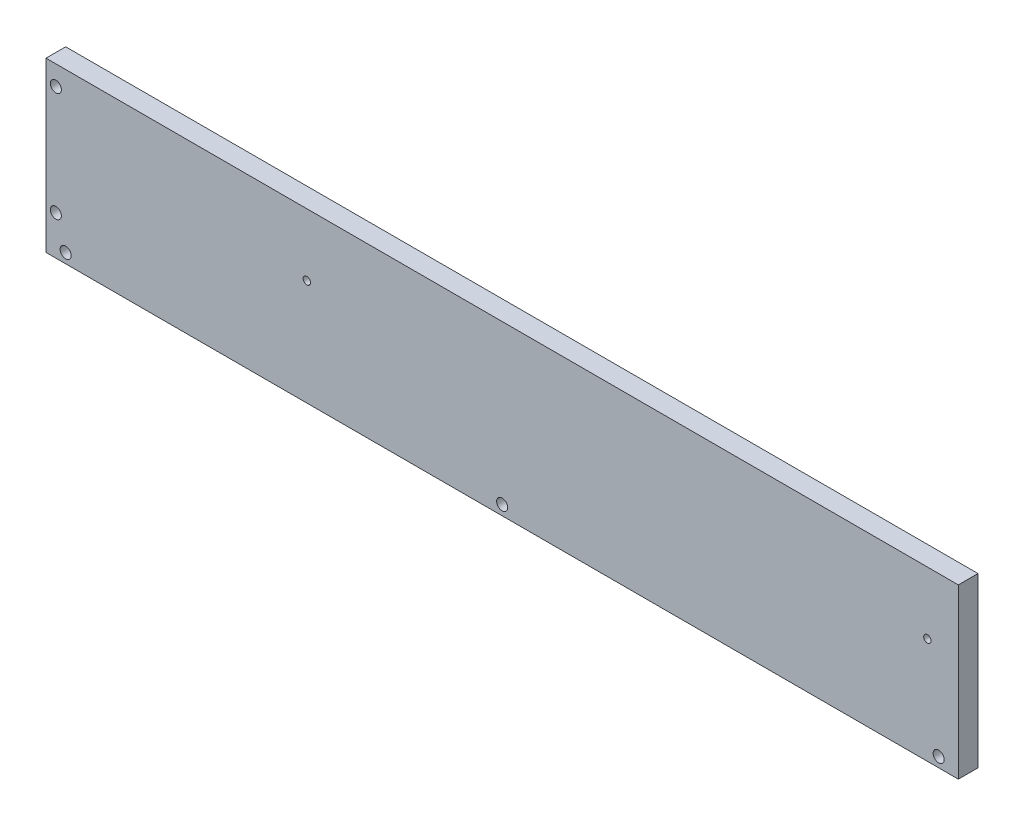
ISO-10303-21;
HEADER;
FILE_DESCRIPTION(('STEP AP214'),'2;1');
FILE_NAME('part.step','',(''),(''),'','','');
FILE_SCHEMA(('AUTOMOTIVE_DESIGN { 1 0 10303 214 1 1 1 1 }'));
ENDSEC;
DATA;
#1=APPLICATION_CONTEXT('core data for automotive mechanical design processes');
#2=APPLICATION_PROTOCOL_DEFINITION('international standard','automotive_design',2000,#1);
#3=PRODUCT_CONTEXT('',#1,'mechanical');
#4=PRODUCT('Part','Part','',(#3));
#5=PRODUCT_RELATED_PRODUCT_CATEGORY('part','',(#4));
#6=PRODUCT_DEFINITION_FORMATION('','',#4);
#7=PRODUCT_DEFINITION_CONTEXT('part definition',#1,'design');
#8=PRODUCT_DEFINITION('design','',#6,#7);
#9=PRODUCT_DEFINITION_SHAPE('','',#8);
#10=(LENGTH_UNIT() NAMED_UNIT(*) SI_UNIT(.MILLI.,.METRE.));
#11=(NAMED_UNIT(*) PLANE_ANGLE_UNIT() SI_UNIT($,.RADIAN.));
#12=(NAMED_UNIT(*) SI_UNIT($,.STERADIAN.) SOLID_ANGLE_UNIT());
#13=UNCERTAINTY_MEASURE_WITH_UNIT(LENGTH_MEASURE(1.E-05),#10,'distance_accuracy_value','');
#14=(GEOMETRIC_REPRESENTATION_CONTEXT(3) GLOBAL_UNCERTAINTY_ASSIGNED_CONTEXT((#13)) GLOBAL_UNIT_ASSIGNED_CONTEXT((#10,
#11,#12)) REPRESENTATION_CONTEXT('',''));
#15=CARTESIAN_POINT('',(0.,0.,0.));
#16=DIRECTION('',(0.,0.,1.));
#17=DIRECTION('',(1.,0.,0.));
#18=AXIS2_PLACEMENT_3D('',#15,#16,#17);
#19=CARTESIAN_POINT('',(0.,0.,6.35));
#20=DIRECTION('',(0.,0.,1.));
#21=DIRECTION('',(1.,0.,0.));
#22=AXIS2_PLACEMENT_3D('',#19,#20,#21);
#23=PLANE('',#22);
#24=CARTESIAN_POINT('',(84.24,34.25,6.35));
#25=DIRECTION('',(0.,0.,1.));
#26=DIRECTION('',(1.,0.,0.));
#27=AXIS2_PLACEMENT_3D('',#24,#25,#26);
#28=CIRCLE('',#27,1.190625);
#29=CARTESIAN_POINT('',(85.4306249999999,34.25,6.35));
#30=VERTEX_POINT('',#29);
#31=EDGE_CURVE('E143',#30,#30,#28,.T.);
#32=ORIENTED_EDGE('',*,*,#31,.F.);
#33=EDGE_LOOP('',(#32));
#34=FACE_BOUND('',#33,.T.);
#35=CARTESIAN_POINT('',(288.29,3.175,6.35));
#36=DIRECTION('',(0.,0.,1.));
#37=DIRECTION('',(1.,0.,0.));
#38=AXIS2_PLACEMENT_3D('',#35,#36,#37);
#39=CIRCLE('',#38,1.78593749999999);
#40=CARTESIAN_POINT('',(290.0759375,3.175,6.35));
#41=VERTEX_POINT('',#40);
#42=EDGE_CURVE('E131',#41,#41,#39,.T.);
#43=ORIENTED_EDGE('',*,*,#42,.F.);
#44=EDGE_LOOP('',(#43));
#45=FACE_BOUND('',#44,.T.);
#46=CARTESIAN_POINT('',(3.17499999999999,12.7,6.35));
#47=DIRECTION('',(0.,0.,1.));
#48=DIRECTION('',(1.,0.,0.));
#49=AXIS2_PLACEMENT_3D('',#46,#47,#48);
#50=CIRCLE('',#49,1.7859375);
#51=CARTESIAN_POINT('',(4.96093749999999,12.7,6.35));
#52=VERTEX_POINT('',#51);
#53=EDGE_CURVE('E119',#52,#52,#50,.T.);
#54=ORIENTED_EDGE('',*,*,#53,.F.);
#55=EDGE_LOOP('',(#54));
#56=FACE_BOUND('',#55,.T.);
#57=DIRECTION('',(-1.,0.,0.));
#58=VECTOR('',#57,1.);
#59=CARTESIAN_POINT('',(294.64,54.35,6.35));
#60=LINE('',#59,#58);
#61=CARTESIAN_POINT('',(294.64,54.35,6.35));
#62=VERTEX_POINT('',#61);
#63=CARTESIAN_POINT('',(0.,54.35,6.35));
#64=VERTEX_POINT('',#63);
#65=EDGE_CURVE('E89',#62,#64,#60,.T.);
#66=ORIENTED_EDGE('',*,*,#65,.T.);
#67=DIRECTION('',(0.,-1.,0.));
#68=VECTOR('',#67,1.);
#69=CARTESIAN_POINT('',(0.,54.35,6.35));
#70=LINE('',#69,#68);
#71=CARTESIAN_POINT('',(0.,0.,6.35));
#72=VERTEX_POINT('',#71);
#73=EDGE_CURVE('E84',#64,#72,#70,.T.);
#74=ORIENTED_EDGE('',*,*,#73,.T.);
#75=DIRECTION('',(1.,0.,0.));
#76=VECTOR('',#75,1.);
#77=CARTESIAN_POINT('',(0.,0.,6.35));
#78=LINE('',#77,#76);
#79=CARTESIAN_POINT('',(294.64,0.,6.35));
#80=VERTEX_POINT('',#79);
#81=EDGE_CURVE('E87',#72,#80,#78,.T.);
#82=ORIENTED_EDGE('',*,*,#81,.T.);
#83=DIRECTION('',(0.,1.,0.));
#84=VECTOR('',#83,1.);
#85=CARTESIAN_POINT('',(294.64,0.,6.35));
#86=LINE('',#85,#84);
#87=EDGE_CURVE('E54',#80,#62,#86,.T.);
#88=ORIENTED_EDGE('',*,*,#87,.T.);
#89=EDGE_LOOP('',(#66,#74,#82,#88));
#90=FACE_BOUND('',#89,.T.);
#91=CARTESIAN_POINT('',(3.17499999999998,48.,6.35));
#92=DIRECTION('',(0.,0.,1.));
#93=DIRECTION('',(1.,0.,0.));
#94=AXIS2_PLACEMENT_3D('',#91,#92,#93);
#95=CIRCLE('',#94,1.7859375);
#96=CARTESIAN_POINT('',(4.96093749999998,48.,6.35));
#97=VERTEX_POINT('',#96);
#98=EDGE_CURVE('E104',#97,#97,#95,.T.);
#99=ORIENTED_EDGE('',*,*,#98,.F.);
#100=EDGE_LOOP('',(#99));
#101=FACE_BOUND('',#100,.T.);
#102=CARTESIAN_POINT('',(6.35,3.175,6.35));
#103=DIRECTION('',(0.,0.,1.));
#104=DIRECTION('',(1.,0.,0.));
#105=AXIS2_PLACEMENT_3D('',#102,#103,#104);
#106=CIRCLE('',#105,1.7859375);
#107=CARTESIAN_POINT('',(8.1359375,3.175,6.35));
#108=VERTEX_POINT('',#107);
#109=EDGE_CURVE('E125',#108,#108,#106,.T.);
#110=ORIENTED_EDGE('',*,*,#109,.F.);
#111=EDGE_LOOP('',(#110));
#112=FACE_BOUND('',#111,.T.);
#113=CARTESIAN_POINT('',(147.32,3.175,6.35));
#114=DIRECTION('',(0.,0.,1.));
#115=DIRECTION('',(1.,0.,0.));
#116=AXIS2_PLACEMENT_3D('',#113,#114,#115);
#117=CIRCLE('',#116,1.78593749999999);
#118=CARTESIAN_POINT('',(149.1059375,3.175,6.35));
#119=VERTEX_POINT('',#118);
#120=EDGE_CURVE('E137',#119,#119,#117,.T.);
#121=ORIENTED_EDGE('',*,*,#120,.F.);
#122=EDGE_LOOP('',(#121));
#123=FACE_BOUND('',#122,.T.);
#124=CARTESIAN_POINT('',(284.64,34.25,6.35));
#125=DIRECTION('',(0.,0.,1.));
#126=DIRECTION('',(1.,0.,0.));
#127=AXIS2_PLACEMENT_3D('',#124,#125,#126);
#128=CIRCLE('',#127,1.19062499999998);
#129=CARTESIAN_POINT('',(285.830625,34.25,6.35));
#130=VERTEX_POINT('',#129);
#131=EDGE_CURVE('E149',#130,#130,#128,.T.);
#132=ORIENTED_EDGE('',*,*,#131,.F.);
#133=EDGE_LOOP('',(#132));
#134=FACE_BOUND('',#133,.T.);
#135=ADVANCED_FACE('F37',(#34,#45,#56,#90,#101,#112,#123,#134),#23,.T.);
#136=CARTESIAN_POINT('',(0.,0.,0.));
#137=DIRECTION('',(0.,0.,1.));
#138=DIRECTION('',(1.,0.,0.));
#139=AXIS2_PLACEMENT_3D('',#136,#137,#138);
#140=PLANE('',#139);
#141=DIRECTION('',(-1.,0.,0.));
#142=VECTOR('',#141,1.);
#143=CARTESIAN_POINT('',(294.64,54.35,0.));
#144=LINE('',#143,#142);
#145=CARTESIAN_POINT('',(294.64,54.35,0.));
#146=VERTEX_POINT('',#145);
#147=CARTESIAN_POINT('',(0.,54.35,0.));
#148=VERTEX_POINT('',#147);
#149=EDGE_CURVE('E101',#146,#148,#144,.T.);
#150=ORIENTED_EDGE('',*,*,#149,.F.);
#151=DIRECTION('',(0.,1.,0.));
#152=VECTOR('',#151,1.);
#153=CARTESIAN_POINT('',(294.64,0.,0.));
#154=LINE('',#153,#152);
#155=CARTESIAN_POINT('',(294.64,0.,0.));
#156=VERTEX_POINT('',#155);
#157=EDGE_CURVE('E77',#156,#146,#154,.T.);
#158=ORIENTED_EDGE('',*,*,#157,.F.);
#159=DIRECTION('',(1.,0.,0.));
#160=VECTOR('',#159,1.);
#161=CARTESIAN_POINT('',(0.,0.,0.));
#162=LINE('',#161,#160);
#163=CARTESIAN_POINT('',(0.,0.,0.));
#164=VERTEX_POINT('',#163);
#165=EDGE_CURVE('E71',#164,#156,#162,.T.);
#166=ORIENTED_EDGE('',*,*,#165,.F.);
#167=DIRECTION('',(0.,-1.,0.));
#168=VECTOR('',#167,1.);
#169=CARTESIAN_POINT('',(0.,54.35,0.));
#170=LINE('',#169,#168);
#171=EDGE_CURVE('E93',#148,#164,#170,.T.);
#172=ORIENTED_EDGE('',*,*,#171,.F.);
#173=EDGE_LOOP('',(#150,#158,#166,#172));
#174=FACE_BOUND('',#173,.T.);
#175=CARTESIAN_POINT('',(3.17499999999998,48.,0.));
#176=DIRECTION('',(0.,0.,1.));
#177=DIRECTION('',(1.,0.,0.));
#178=AXIS2_PLACEMENT_3D('',#175,#176,#177);
#179=CIRCLE('',#178,1.7859375);
#180=CARTESIAN_POINT('',(4.96093749999998,48.,0.));
#181=VERTEX_POINT('',#180);
#182=EDGE_CURVE('E116',#181,#181,#179,.T.);
#183=ORIENTED_EDGE('',*,*,#182,.T.);
#184=EDGE_LOOP('',(#183));
#185=FACE_BOUND('',#184,.T.);
#186=CARTESIAN_POINT('',(3.17499999999999,12.7,0.));
#187=DIRECTION('',(0.,0.,1.));
#188=DIRECTION('',(1.,0.,0.));
#189=AXIS2_PLACEMENT_3D('',#186,#187,#188);
#190=CIRCLE('',#189,1.7859375);
#191=CARTESIAN_POINT('',(4.96093749999999,12.7,0.));
#192=VERTEX_POINT('',#191);
#193=EDGE_CURVE('E122',#192,#192,#190,.T.);
#194=ORIENTED_EDGE('',*,*,#193,.T.);
#195=EDGE_LOOP('',(#194));
#196=FACE_BOUND('',#195,.T.);
#197=CARTESIAN_POINT('',(6.35,3.175,0.));
#198=DIRECTION('',(0.,0.,1.));
#199=DIRECTION('',(1.,0.,0.));
#200=AXIS2_PLACEMENT_3D('',#197,#198,#199);
#201=CIRCLE('',#200,1.7859375);
#202=CARTESIAN_POINT('',(8.1359375,3.175,0.));
#203=VERTEX_POINT('',#202);
#204=EDGE_CURVE('E128',#203,#203,#201,.T.);
#205=ORIENTED_EDGE('',*,*,#204,.T.);
#206=EDGE_LOOP('',(#205));
#207=FACE_BOUND('',#206,.T.);
#208=CARTESIAN_POINT('',(288.29,3.175,0.));
#209=DIRECTION('',(0.,0.,1.));
#210=DIRECTION('',(1.,0.,0.));
#211=AXIS2_PLACEMENT_3D('',#208,#209,#210);
#212=CIRCLE('',#211,1.78593749999999);
#213=CARTESIAN_POINT('',(290.0759375,3.175,0.));
#214=VERTEX_POINT('',#213);
#215=EDGE_CURVE('E134',#214,#214,#212,.T.);
#216=ORIENTED_EDGE('',*,*,#215,.T.);
#217=EDGE_LOOP('',(#216));
#218=FACE_BOUND('',#217,.T.);
#219=CARTESIAN_POINT('',(147.32,3.175,0.));
#220=DIRECTION('',(0.,0.,1.));
#221=DIRECTION('',(1.,0.,0.));
#222=AXIS2_PLACEMENT_3D('',#219,#220,#221);
#223=CIRCLE('',#222,1.78593749999999);
#224=CARTESIAN_POINT('',(149.1059375,3.175,0.));
#225=VERTEX_POINT('',#224);
#226=EDGE_CURVE('E140',#225,#225,#223,.T.);
#227=ORIENTED_EDGE('',*,*,#226,.T.);
#228=EDGE_LOOP('',(#227));
#229=FACE_BOUND('',#228,.T.);
#230=CARTESIAN_POINT('',(84.24,34.25,0.));
#231=DIRECTION('',(0.,0.,1.));
#232=DIRECTION('',(1.,0.,0.));
#233=AXIS2_PLACEMENT_3D('',#230,#231,#232);
#234=CIRCLE('',#233,1.190625);
#235=CARTESIAN_POINT('',(85.4306249999999,34.25,0.));
#236=VERTEX_POINT('',#235);
#237=EDGE_CURVE('E146',#236,#236,#234,.T.);
#238=ORIENTED_EDGE('',*,*,#237,.T.);
#239=EDGE_LOOP('',(#238));
#240=FACE_BOUND('',#239,.T.);
#241=CARTESIAN_POINT('',(284.64,34.25,0.));
#242=DIRECTION('',(0.,0.,1.));
#243=DIRECTION('',(1.,0.,0.));
#244=AXIS2_PLACEMENT_3D('',#241,#242,#243);
#245=CIRCLE('',#244,1.19062499999998);
#246=CARTESIAN_POINT('',(285.830625,34.25,0.));
#247=VERTEX_POINT('',#246);
#248=EDGE_CURVE('E152',#247,#247,#245,.T.);
#249=ORIENTED_EDGE('',*,*,#248,.T.);
#250=EDGE_LOOP('',(#249));
#251=FACE_BOUND('',#250,.T.);
#252=ADVANCED_FACE('F112',(#174,#185,#196,#207,#218,#229,#240,#251),#140,.F.);
#253=CARTESIAN_POINT('',(294.64,54.35,6.35));
#254=DIRECTION('',(0.,-1.,0.));
#255=DIRECTION('',(0.,0.,-1.));
#256=AXIS2_PLACEMENT_3D('',#253,#254,#255);
#257=PLANE('',#256);
#258=ORIENTED_EDGE('',*,*,#149,.T.);
#259=DIRECTION('',(0.,0.,-1.));
#260=VECTOR('',#259,1.);
#261=CARTESIAN_POINT('',(0.,54.35,6.35));
#262=LINE('',#261,#260);
#263=EDGE_CURVE('E11',#64,#148,#262,.T.);
#264=ORIENTED_EDGE('',*,*,#263,.F.);
#265=ORIENTED_EDGE('',*,*,#65,.F.);
#266=DIRECTION('',(0.,0.,-1.));
#267=VECTOR('',#266,1.);
#268=CARTESIAN_POINT('',(294.64,54.35,6.35));
#269=LINE('',#268,#267);
#270=EDGE_CURVE('E97',#62,#146,#269,.T.);
#271=ORIENTED_EDGE('',*,*,#270,.T.);
#272=EDGE_LOOP('',(#258,#264,#265,#271));
#273=FACE_BOUND('',#272,.T.);
#274=ADVANCED_FACE('F39',(#273),#257,.F.);
#275=CARTESIAN_POINT('',(0.,54.35,6.35));
#276=DIRECTION('',(1.,0.,0.));
#277=DIRECTION('',(0.,0.,-1.));
#278=AXIS2_PLACEMENT_3D('',#275,#276,#277);
#279=PLANE('',#278);
#280=ORIENTED_EDGE('',*,*,#171,.T.);
#281=DIRECTION('',(0.,0.,-1.));
#282=VECTOR('',#281,1.);
#283=CARTESIAN_POINT('',(0.,0.,6.35));
#284=LINE('',#283,#282);
#285=EDGE_CURVE('E46',#72,#164,#284,.T.);
#286=ORIENTED_EDGE('',*,*,#285,.F.);
#287=ORIENTED_EDGE('',*,*,#73,.F.);
#288=ORIENTED_EDGE('',*,*,#263,.T.);
#289=EDGE_LOOP('',(#280,#286,#287,#288));
#290=FACE_BOUND('',#289,.T.);
#291=ADVANCED_FACE('F92',(#290),#279,.F.);
#292=CARTESIAN_POINT('',(0.,0.,6.35));
#293=DIRECTION('',(0.,1.,0.));
#294=DIRECTION('',(0.,0.,1.));
#295=AXIS2_PLACEMENT_3D('',#292,#293,#294);
#296=PLANE('',#295);
#297=ORIENTED_EDGE('',*,*,#165,.T.);
#298=DIRECTION('',(0.,0.,-1.));
#299=VECTOR('',#298,1.);
#300=CARTESIAN_POINT('',(294.64,0.,6.35));
#301=LINE('',#300,#299);
#302=EDGE_CURVE('E94',#80,#156,#301,.T.);
#303=ORIENTED_EDGE('',*,*,#302,.F.);
#304=ORIENTED_EDGE('',*,*,#81,.F.);
#305=ORIENTED_EDGE('',*,*,#285,.T.);
#306=EDGE_LOOP('',(#297,#303,#304,#305));
#307=FACE_BOUND('',#306,.T.);
#308=ADVANCED_FACE('F95',(#307),#296,.F.);
#309=CARTESIAN_POINT('',(294.64,0.,6.35));
#310=DIRECTION('',(-1.,0.,0.));
#311=DIRECTION('',(0.,0.,1.));
#312=AXIS2_PLACEMENT_3D('',#309,#310,#311);
#313=PLANE('',#312);
#314=ORIENTED_EDGE('',*,*,#157,.T.);
#315=ORIENTED_EDGE('',*,*,#270,.F.);
#316=ORIENTED_EDGE('',*,*,#87,.F.);
#317=ORIENTED_EDGE('',*,*,#302,.T.);
#318=EDGE_LOOP('',(#314,#315,#316,#317));
#319=FACE_BOUND('',#318,.T.);
#320=ADVANCED_FACE('F109',(#319),#313,.F.);
#321=CARTESIAN_POINT('',(3.17499999999998,48.,6.35));
#322=DIRECTION('',(0.,0.,-1.));
#323=DIRECTION('',(-1.,0.,0.));
#324=AXIS2_PLACEMENT_3D('',#321,#322,#323);
#325=CYLINDRICAL_SURFACE('',#324,1.7859375);
#326=ORIENTED_EDGE('',*,*,#98,.T.);
#327=EDGE_LOOP('',(#326));
#328=FACE_BOUND('',#327,.T.);
#329=ORIENTED_EDGE('',*,*,#182,.F.);
#330=EDGE_LOOP('',(#329));
#331=FACE_BOUND('',#330,.T.);
#332=ADVANCED_FACE('F171',(#328,#331),#325,.F.);
#333=CARTESIAN_POINT('',(3.17499999999999,12.7,6.35));
#334=DIRECTION('',(0.,0.,-1.));
#335=DIRECTION('',(-1.,0.,0.));
#336=AXIS2_PLACEMENT_3D('',#333,#334,#335);
#337=CYLINDRICAL_SURFACE('',#336,1.7859375);
#338=ORIENTED_EDGE('',*,*,#53,.T.);
#339=EDGE_LOOP('',(#338));
#340=FACE_BOUND('',#339,.T.);
#341=ORIENTED_EDGE('',*,*,#193,.F.);
#342=EDGE_LOOP('',(#341));
#343=FACE_BOUND('',#342,.T.);
#344=ADVANCED_FACE('F217',(#340,#343),#337,.F.);
#345=CARTESIAN_POINT('',(6.35,3.175,6.35));
#346=DIRECTION('',(0.,0.,-1.));
#347=DIRECTION('',(-1.,0.,0.));
#348=AXIS2_PLACEMENT_3D('',#345,#346,#347);
#349=CYLINDRICAL_SURFACE('',#348,1.7859375);
#350=ORIENTED_EDGE('',*,*,#109,.T.);
#351=EDGE_LOOP('',(#350));
#352=FACE_BOUND('',#351,.T.);
#353=ORIENTED_EDGE('',*,*,#204,.F.);
#354=EDGE_LOOP('',(#353));
#355=FACE_BOUND('',#354,.T.);
#356=ADVANCED_FACE('F225',(#352,#355),#349,.F.);
#357=CARTESIAN_POINT('',(288.29,3.175,6.35));
#358=DIRECTION('',(0.,0.,-1.));
#359=DIRECTION('',(-1.,0.,0.));
#360=AXIS2_PLACEMENT_3D('',#357,#358,#359);
#361=CYLINDRICAL_SURFACE('',#360,1.78593749999999);
#362=ORIENTED_EDGE('',*,*,#42,.T.);
#363=EDGE_LOOP('',(#362));
#364=FACE_BOUND('',#363,.T.);
#365=ORIENTED_EDGE('',*,*,#215,.F.);
#366=EDGE_LOOP('',(#365));
#367=FACE_BOUND('',#366,.T.);
#368=ADVANCED_FACE('F233',(#364,#367),#361,.F.);
#369=CARTESIAN_POINT('',(147.32,3.175,6.35));
#370=DIRECTION('',(0.,0.,-1.));
#371=DIRECTION('',(-1.,0.,0.));
#372=AXIS2_PLACEMENT_3D('',#369,#370,#371);
#373=CYLINDRICAL_SURFACE('',#372,1.78593749999999);
#374=ORIENTED_EDGE('',*,*,#120,.T.);
#375=EDGE_LOOP('',(#374));
#376=FACE_BOUND('',#375,.T.);
#377=ORIENTED_EDGE('',*,*,#226,.F.);
#378=EDGE_LOOP('',(#377));
#379=FACE_BOUND('',#378,.T.);
#380=ADVANCED_FACE('F242',(#376,#379),#373,.F.);
#381=CARTESIAN_POINT('',(84.24,34.25,6.35));
#382=DIRECTION('',(0.,0.,-1.));
#383=DIRECTION('',(-1.,0.,0.));
#384=AXIS2_PLACEMENT_3D('',#381,#382,#383);
#385=CYLINDRICAL_SURFACE('',#384,1.190625);
#386=ORIENTED_EDGE('',*,*,#31,.T.);
#387=EDGE_LOOP('',(#386));
#388=FACE_BOUND('',#387,.T.);
#389=ORIENTED_EDGE('',*,*,#237,.F.);
#390=EDGE_LOOP('',(#389));
#391=FACE_BOUND('',#390,.T.);
#392=ADVANCED_FACE('F251',(#388,#391),#385,.F.);
#393=CARTESIAN_POINT('',(284.64,34.25,6.35));
#394=DIRECTION('',(0.,0.,-1.));
#395=DIRECTION('',(-1.,0.,0.));
#396=AXIS2_PLACEMENT_3D('',#393,#394,#395);
#397=CYLINDRICAL_SURFACE('',#396,1.19062499999998);
#398=ORIENTED_EDGE('',*,*,#131,.T.);
#399=EDGE_LOOP('',(#398));
#400=FACE_BOUND('',#399,.T.);
#401=ORIENTED_EDGE('',*,*,#248,.F.);
#402=EDGE_LOOP('',(#401));
#403=FACE_BOUND('',#402,.T.);
#404=ADVANCED_FACE('F158',(#400,#403),#397,.F.);
#405=CLOSED_SHELL('',(#135,#252,#274,#291,#308,#320,#332,#344,#356,#368,#380,#392,#404));
#406=MANIFOLD_SOLID_BREP('B2',#405);
#407=ADVANCED_BREP_SHAPE_REPRESENTATION('',(#18,#406),#14);
#408=SHAPE_DEFINITION_REPRESENTATION(#9,#407);
ENDSEC;
END-ISO-10303-21;
